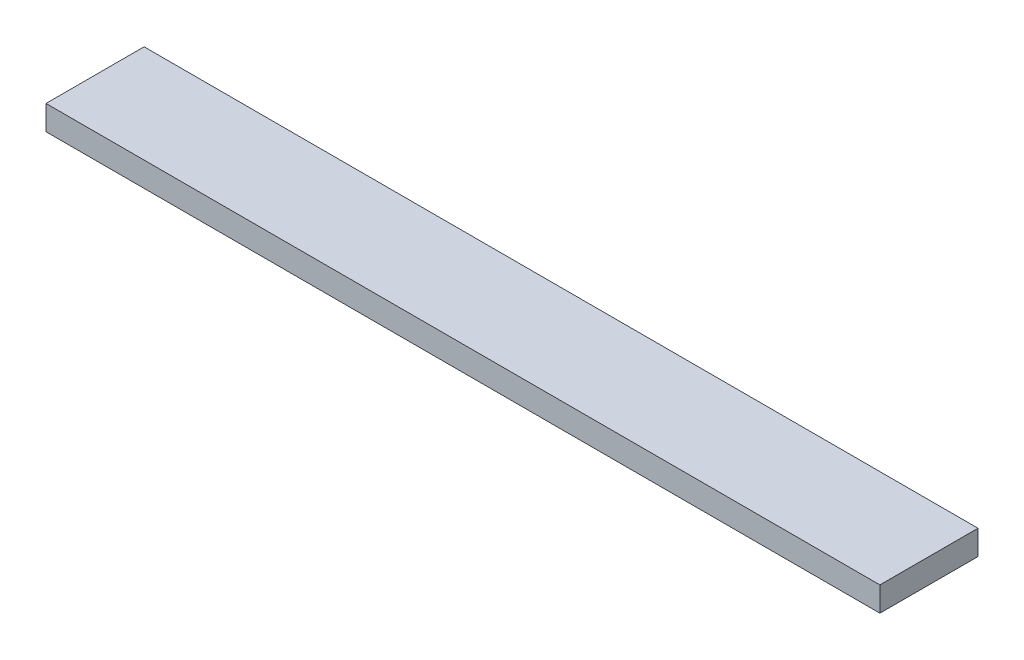
ISO-10303-21;
HEADER;
FILE_DESCRIPTION(('STEP AP214'),'2;1');
FILE_NAME('part.step','',(''),(''),'','','');
FILE_SCHEMA(('AUTOMOTIVE_DESIGN { 1 0 10303 214 1 1 1 1 }'));
ENDSEC;
DATA;
#1=APPLICATION_CONTEXT('core data for automotive mechanical design processes');
#2=APPLICATION_PROTOCOL_DEFINITION('international standard','automotive_design',2000,#1);
#3=PRODUCT_CONTEXT('',#1,'mechanical');
#4=PRODUCT('Part','Part','',(#3));
#5=PRODUCT_RELATED_PRODUCT_CATEGORY('part','',(#4));
#6=PRODUCT_DEFINITION_FORMATION('','',#4);
#7=PRODUCT_DEFINITION_CONTEXT('part definition',#1,'design');
#8=PRODUCT_DEFINITION('design','',#6,#7);
#9=PRODUCT_DEFINITION_SHAPE('','',#8);
#10=(LENGTH_UNIT() NAMED_UNIT(*) SI_UNIT(.MILLI.,.METRE.));
#11=(NAMED_UNIT(*) PLANE_ANGLE_UNIT() SI_UNIT($,.RADIAN.));
#12=(NAMED_UNIT(*) SI_UNIT($,.STERADIAN.) SOLID_ANGLE_UNIT());
#13=UNCERTAINTY_MEASURE_WITH_UNIT(LENGTH_MEASURE(1.E-05),#10,'distance_accuracy_value','');
#14=(GEOMETRIC_REPRESENTATION_CONTEXT(3) GLOBAL_UNCERTAINTY_ASSIGNED_CONTEXT((#13)) GLOBAL_UNIT_ASSIGNED_CONTEXT((#10,
#11,#12)) REPRESENTATION_CONTEXT('',''));
#15=CARTESIAN_POINT('',(0.,0.,0.));
#16=DIRECTION('',(0.,0.,1.));
#17=DIRECTION('',(1.,0.,0.));
#18=AXIS2_PLACEMENT_3D('',#15,#16,#17);
#19=CARTESIAN_POINT('',(85.,-2.5,20.));
#20=DIRECTION('',(-1.,0.,0.));
#21=DIRECTION('',(0.,0.,1.));
#22=AXIS2_PLACEMENT_3D('',#19,#20,#21);
#23=PLANE('',#22);
#24=DIRECTION('',(0.,1.,0.));
#25=VECTOR('',#24,1.);
#26=CARTESIAN_POINT('',(85.,-2.5,0.));
#27=LINE('',#26,#25);
#28=CARTESIAN_POINT('',(85.,-2.5,0.));
#29=VERTEX_POINT('',#28);
#30=CARTESIAN_POINT('',(85.,2.5,0.));
#31=VERTEX_POINT('',#30);
#32=EDGE_CURVE('E98',#29,#31,#27,.T.);
#33=ORIENTED_EDGE('',*,*,#32,.T.);
#34=DIRECTION('',(0.,0.,-1.));
#35=VECTOR('',#34,1.);
#36=CARTESIAN_POINT('',(85.,2.5,20.));
#37=LINE('',#36,#35);
#38=CARTESIAN_POINT('',(85.,2.5,20.));
#39=VERTEX_POINT('',#38);
#40=EDGE_CURVE('E11',#39,#31,#37,.T.);
#41=ORIENTED_EDGE('',*,*,#40,.F.);
#42=DIRECTION('',(0.,1.,0.));
#43=VECTOR('',#42,1.);
#44=CARTESIAN_POINT('',(85.,-2.5,20.));
#45=LINE('',#44,#43);
#46=CARTESIAN_POINT('',(85.,-2.5,20.));
#47=VERTEX_POINT('',#46);
#48=EDGE_CURVE('E86',#47,#39,#45,.T.);
#49=ORIENTED_EDGE('',*,*,#48,.F.);
#50=DIRECTION('',(0.,0.,-1.));
#51=VECTOR('',#50,1.);
#52=CARTESIAN_POINT('',(85.,-2.5,20.));
#53=LINE('',#52,#51);
#54=EDGE_CURVE('E94',#47,#29,#53,.T.);
#55=ORIENTED_EDGE('',*,*,#54,.T.);
#56=EDGE_LOOP('',(#33,#41,#49,#55));
#57=FACE_BOUND('',#56,.T.);
#58=ADVANCED_FACE('F35',(#57),#23,.F.);
#59=CARTESIAN_POINT('',(-85.,2.5,20.));
#60=DIRECTION('',(0.,-1.,0.));
#61=DIRECTION('',(0.,0.,-1.));
#62=AXIS2_PLACEMENT_3D('',#59,#60,#61);
#63=PLANE('',#62);
#64=DIRECTION('',(-1.,0.,0.));
#65=VECTOR('',#64,1.);
#66=CARTESIAN_POINT('',(-85.,2.5,0.));
#67=LINE('',#66,#65);
#68=CARTESIAN_POINT('',(-85.,2.5,0.));
#69=VERTEX_POINT('',#68);
#70=EDGE_CURVE('E90',#31,#69,#67,.T.);
#71=ORIENTED_EDGE('',*,*,#70,.T.);
#72=DIRECTION('',(0.,0.,-1.));
#73=VECTOR('',#72,1.);
#74=CARTESIAN_POINT('',(-85.,2.5,20.));
#75=LINE('',#74,#73);
#76=CARTESIAN_POINT('',(-85.,2.5,20.));
#77=VERTEX_POINT('',#76);
#78=EDGE_CURVE('E43',#77,#69,#75,.T.);
#79=ORIENTED_EDGE('',*,*,#78,.F.);
#80=DIRECTION('',(-1.,0.,0.));
#81=VECTOR('',#80,1.);
#82=CARTESIAN_POINT('',(-85.,2.5,20.));
#83=LINE('',#82,#81);
#84=EDGE_CURVE('E81',#39,#77,#83,.T.);
#85=ORIENTED_EDGE('',*,*,#84,.F.);
#86=ORIENTED_EDGE('',*,*,#40,.T.);
#87=EDGE_LOOP('',(#71,#79,#85,#86));
#88=FACE_BOUND('',#87,.T.);
#89=ADVANCED_FACE('F89',(#88),#63,.F.);
#90=CARTESIAN_POINT('',(-85.,-2.5,20.));
#91=DIRECTION('',(1.,0.,0.));
#92=DIRECTION('',(0.,0.,-1.));
#93=AXIS2_PLACEMENT_3D('',#90,#91,#92);
#94=PLANE('',#93);
#95=DIRECTION('',(0.,-1.,0.));
#96=VECTOR('',#95,1.);
#97=CARTESIAN_POINT('',(-85.,-2.5,0.));
#98=LINE('',#97,#96);
#99=CARTESIAN_POINT('',(-85.,-2.5,0.));
#100=VERTEX_POINT('',#99);
#101=EDGE_CURVE('E68',#69,#100,#98,.T.);
#102=ORIENTED_EDGE('',*,*,#101,.T.);
#103=DIRECTION('',(0.,0.,-1.));
#104=VECTOR('',#103,1.);
#105=CARTESIAN_POINT('',(-85.,-2.5,20.));
#106=LINE('',#105,#104);
#107=CARTESIAN_POINT('',(-85.,-2.5,20.));
#108=VERTEX_POINT('',#107);
#109=EDGE_CURVE('E91',#108,#100,#106,.T.);
#110=ORIENTED_EDGE('',*,*,#109,.F.);
#111=DIRECTION('',(0.,-1.,0.));
#112=VECTOR('',#111,1.);
#113=CARTESIAN_POINT('',(-85.,-2.5,20.));
#114=LINE('',#113,#112);
#115=EDGE_CURVE('E84',#77,#108,#114,.T.);
#116=ORIENTED_EDGE('',*,*,#115,.F.);
#117=ORIENTED_EDGE('',*,*,#78,.T.);
#118=EDGE_LOOP('',(#102,#110,#116,#117));
#119=FACE_BOUND('',#118,.T.);
#120=ADVANCED_FACE('F92',(#119),#94,.F.);
#121=CARTESIAN_POINT('',(-85.,-2.5,20.));
#122=DIRECTION('',(0.,1.,0.));
#123=DIRECTION('',(0.,0.,1.));
#124=AXIS2_PLACEMENT_3D('',#121,#122,#123);
#125=PLANE('',#124);
#126=DIRECTION('',(1.,0.,0.));
#127=VECTOR('',#126,1.);
#128=CARTESIAN_POINT('',(-85.,-2.5,0.));
#129=LINE('',#128,#127);
#130=EDGE_CURVE('E74',#100,#29,#129,.T.);
#131=ORIENTED_EDGE('',*,*,#130,.T.);
#132=ORIENTED_EDGE('',*,*,#54,.F.);
#133=DIRECTION('',(1.,0.,0.));
#134=VECTOR('',#133,1.);
#135=CARTESIAN_POINT('',(-85.,-2.5,20.));
#136=LINE('',#135,#134);
#137=EDGE_CURVE('E51',#108,#47,#136,.T.);
#138=ORIENTED_EDGE('',*,*,#137,.F.);
#139=ORIENTED_EDGE('',*,*,#109,.T.);
#140=EDGE_LOOP('',(#131,#132,#138,#139));
#141=FACE_BOUND('',#140,.T.);
#142=ADVANCED_FACE('F105',(#141),#125,.F.);
#143=CARTESIAN_POINT('',(0.,0.,20.));
#144=DIRECTION('',(0.,0.,-1.));
#145=DIRECTION('',(-1.,0.,0.));
#146=AXIS2_PLACEMENT_3D('',#143,#144,#145);
#147=PLANE('',#146);
#148=ORIENTED_EDGE('',*,*,#48,.T.);
#149=ORIENTED_EDGE('',*,*,#84,.T.);
#150=ORIENTED_EDGE('',*,*,#115,.T.);
#151=ORIENTED_EDGE('',*,*,#137,.T.);
#152=EDGE_LOOP('',(#148,#149,#150,#151));
#153=FACE_BOUND('',#152,.T.);
#154=ADVANCED_FACE('F82',(#153),#147,.F.);
#155=CARTESIAN_POINT('',(0.,0.,0.));
#156=DIRECTION('',(0.,0.,-1.));
#157=DIRECTION('',(-1.,0.,0.));
#158=AXIS2_PLACEMENT_3D('',#155,#156,#157);
#159=PLANE('',#158);
#160=ORIENTED_EDGE('',*,*,#32,.F.);
#161=ORIENTED_EDGE('',*,*,#130,.F.);
#162=ORIENTED_EDGE('',*,*,#101,.F.);
#163=ORIENTED_EDGE('',*,*,#70,.F.);
#164=EDGE_LOOP('',(#160,#161,#162,#163));
#165=FACE_BOUND('',#164,.T.);
#166=ADVANCED_FACE('F108',(#165),#159,.T.);
#167=CLOSED_SHELL('',(#58,#89,#120,#142,#154,#166));
#168=MANIFOLD_SOLID_BREP('B2',#167);
#169=ADVANCED_BREP_SHAPE_REPRESENTATION('',(#18,#168),#14);
#170=SHAPE_DEFINITION_REPRESENTATION(#9,#169);
ENDSEC;
END-ISO-10303-21;
